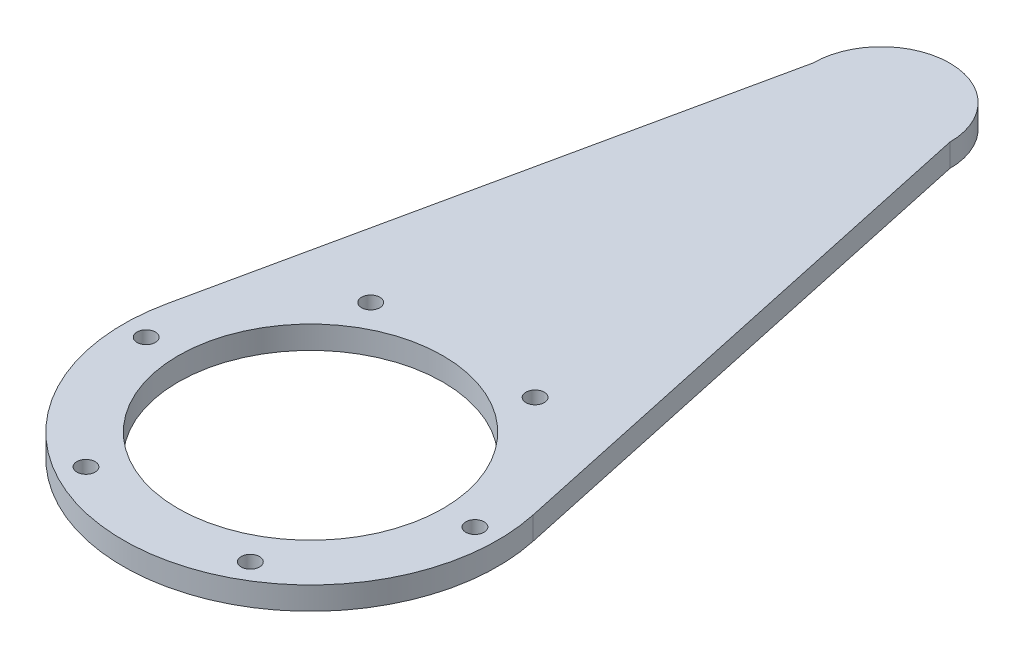
ISO-10303-21;
HEADER;
FILE_DESCRIPTION(('STEP AP214'),'2;1');
FILE_NAME('part.step','',(''),(''),'','','');
FILE_SCHEMA(('AUTOMOTIVE_DESIGN { 1 0 10303 214 1 1 1 1 }'));
ENDSEC;
DATA;
#1=APPLICATION_CONTEXT('core data for automotive mechanical design processes');
#2=APPLICATION_PROTOCOL_DEFINITION('international standard','automotive_design',2000,#1);
#3=PRODUCT_CONTEXT('',#1,'mechanical');
#4=PRODUCT('Part','Part','',(#3));
#5=PRODUCT_RELATED_PRODUCT_CATEGORY('part','',(#4));
#6=PRODUCT_DEFINITION_FORMATION('','',#4);
#7=PRODUCT_DEFINITION_CONTEXT('part definition',#1,'design');
#8=PRODUCT_DEFINITION('design','',#6,#7);
#9=PRODUCT_DEFINITION_SHAPE('','',#8);
#10=(LENGTH_UNIT() NAMED_UNIT(*) SI_UNIT(.MILLI.,.METRE.));
#11=(NAMED_UNIT(*) PLANE_ANGLE_UNIT() SI_UNIT($,.RADIAN.));
#12=(NAMED_UNIT(*) SI_UNIT($,.STERADIAN.) SOLID_ANGLE_UNIT());
#13=UNCERTAINTY_MEASURE_WITH_UNIT(LENGTH_MEASURE(1.E-05),#10,'distance_accuracy_value','');
#14=(GEOMETRIC_REPRESENTATION_CONTEXT(3) GLOBAL_UNCERTAINTY_ASSIGNED_CONTEXT((#13)) GLOBAL_UNIT_ASSIGNED_CONTEXT((#10,
#11,#12)) REPRESENTATION_CONTEXT('',''));
#15=CARTESIAN_POINT('',(0.,0.,0.));
#16=DIRECTION('',(0.,0.,1.));
#17=DIRECTION('',(1.,0.,0.));
#18=AXIS2_PLACEMENT_3D('',#15,#16,#17);
#19=CARTESIAN_POINT('',(0.,5.,-125.));
#20=DIRECTION('',(0.,1.,0.));
#21=DIRECTION('',(0.,0.,1.));
#22=AXIS2_PLACEMENT_3D('',#19,#20,#21);
#23=PLANE('',#22);
#24=CARTESIAN_POINT('',(-18.,5.,-31.1769145362398));
#25=DIRECTION('',(0.,1.,0.));
#26=DIRECTION('',(0.,0.,1.));
#27=AXIS2_PLACEMENT_3D('',#24,#25,#26);
#28=CIRCLE('',#27,2.);
#29=CARTESIAN_POINT('',(-18.,5.,-29.1769145362398));
#30=VERTEX_POINT('',#29);
#31=EDGE_CURVE('E172',#30,#30,#28,.T.);
#32=ORIENTED_EDGE('',*,*,#31,.F.);
#33=EDGE_LOOP('',(#32));
#34=FACE_BOUND('',#33,.T.);
#35=CARTESIAN_POINT('',(-18.,5.,31.1769145362398));
#36=DIRECTION('',(0.,1.,0.));
#37=DIRECTION('',(0.,0.,1.));
#38=AXIS2_PLACEMENT_3D('',#35,#36,#37);
#39=CIRCLE('',#38,2.00000000000001);
#40=CARTESIAN_POINT('',(-18.,5.,33.1769145362398));
#41=VERTEX_POINT('',#40);
#42=EDGE_CURVE('E156',#41,#41,#39,.T.);
#43=ORIENTED_EDGE('',*,*,#42,.F.);
#44=EDGE_LOOP('',(#43));
#45=FACE_BOUND('',#44,.T.);
#46=CARTESIAN_POINT('',(36.,5.,0.));
#47=DIRECTION('',(0.,1.,0.));
#48=DIRECTION('',(0.,0.,1.));
#49=AXIS2_PLACEMENT_3D('',#46,#47,#48);
#50=CIRCLE('',#49,2.);
#51=CARTESIAN_POINT('',(36.,5.,2.));
#52=VERTEX_POINT('',#51);
#53=EDGE_CURVE('E140',#52,#52,#50,.T.);
#54=ORIENTED_EDGE('',*,*,#53,.F.);
#55=EDGE_LOOP('',(#54));
#56=FACE_BOUND('',#55,.T.);
#57=CARTESIAN_POINT('',(0.,5.,-125.));
#58=DIRECTION('',(0.,1.,0.));
#59=DIRECTION('',(0.,0.,1.));
#60=AXIS2_PLACEMENT_3D('',#57,#58,#59);
#61=CIRCLE('',#60,15.);
#62=CARTESIAN_POINT('',(15.,5.,-125.));
#63=VERTEX_POINT('',#62);
#64=CARTESIAN_POINT('',(-15.,5.,-125.));
#65=VERTEX_POINT('',#64);
#66=EDGE_CURVE('E98',#63,#65,#61,.T.);
#67=ORIENTED_EDGE('',*,*,#66,.T.);
#68=DIRECTION('',(-0.210693745710355,0.,0.977552119080379));
#69=VECTOR('',#68,1.);
#70=CARTESIAN_POINT('',(-15.,5.,-125.));
#71=LINE('',#70,#69);
#72=CARTESIAN_POINT('',(-40.0796368822956,5.,-8.63844357412454));
#73=VERTEX_POINT('',#72);
#74=EDGE_CURVE('E93',#65,#73,#71,.T.);
#75=ORIENTED_EDGE('',*,*,#74,.T.);
#76=CARTESIAN_POINT('',(0.,5.,0.));
#77=DIRECTION('',(0.,1.,0.));
#78=DIRECTION('',(0.,0.,1.));
#79=AXIS2_PLACEMENT_3D('',#76,#77,#78);
#80=CIRCLE('',#79,41.);
#81=CARTESIAN_POINT('',(40.0796368822956,5.,-8.63844357412453));
#82=VERTEX_POINT('',#81);
#83=EDGE_CURVE('E96',#73,#82,#80,.T.);
#84=ORIENTED_EDGE('',*,*,#83,.T.);
#85=DIRECTION('',(-0.210693745710355,0.,-0.977552119080379));
#86=VECTOR('',#85,1.);
#87=CARTESIAN_POINT('',(15.,5.,-125.));
#88=LINE('',#87,#86);
#89=EDGE_CURVE('E63',#82,#63,#88,.T.);
#90=ORIENTED_EDGE('',*,*,#89,.T.);
#91=EDGE_LOOP('',(#67,#75,#84,#90));
#92=FACE_BOUND('',#91,.T.);
#93=CARTESIAN_POINT('',(0.,5.,0.));
#94=DIRECTION('',(0.,1.,0.));
#95=DIRECTION('',(0.,0.,1.));
#96=AXIS2_PLACEMENT_3D('',#93,#94,#95);
#97=CIRCLE('',#96,29.);
#98=CARTESIAN_POINT('',(0.,5.,29.));
#99=VERTEX_POINT('',#98);
#100=EDGE_CURVE('E118',#99,#99,#97,.T.);
#101=ORIENTED_EDGE('',*,*,#100,.F.);
#102=EDGE_LOOP('',(#101));
#103=FACE_BOUND('',#102,.T.);
#104=CARTESIAN_POINT('',(18.,5.,31.1769145362398));
#105=DIRECTION('',(0.,1.,0.));
#106=DIRECTION('',(0.,0.,1.));
#107=AXIS2_PLACEMENT_3D('',#104,#105,#106);
#108=CIRCLE('',#107,2.00000000000001);
#109=CARTESIAN_POINT('',(18.,5.,33.1769145362398));
#110=VERTEX_POINT('',#109);
#111=EDGE_CURVE('E148',#110,#110,#108,.T.);
#112=ORIENTED_EDGE('',*,*,#111,.F.);
#113=EDGE_LOOP('',(#112));
#114=FACE_BOUND('',#113,.T.);
#115=CARTESIAN_POINT('',(-36.,5.,0.));
#116=DIRECTION('',(0.,1.,0.));
#117=DIRECTION('',(0.,0.,1.));
#118=AXIS2_PLACEMENT_3D('',#115,#116,#117);
#119=CIRCLE('',#118,2.00000000000001);
#120=CARTESIAN_POINT('',(-36.,5.,2.00000000000001));
#121=VERTEX_POINT('',#120);
#122=EDGE_CURVE('E164',#121,#121,#119,.T.);
#123=ORIENTED_EDGE('',*,*,#122,.F.);
#124=EDGE_LOOP('',(#123));
#125=FACE_BOUND('',#124,.T.);
#126=CARTESIAN_POINT('',(18.,5.,-31.1769145362398));
#127=DIRECTION('',(0.,1.,0.));
#128=DIRECTION('',(0.,0.,1.));
#129=AXIS2_PLACEMENT_3D('',#126,#127,#128);
#130=CIRCLE('',#129,2.00000000000001);
#131=CARTESIAN_POINT('',(18.,5.,-29.1769145362398));
#132=VERTEX_POINT('',#131);
#133=EDGE_CURVE('E180',#132,#132,#130,.T.);
#134=ORIENTED_EDGE('',*,*,#133,.F.);
#135=EDGE_LOOP('',(#134));
#136=FACE_BOUND('',#135,.T.);
#137=ADVANCED_FACE('F45',(#34,#45,#56,#92,#103,#114,#125,#136),#23,.T.);
#138=CARTESIAN_POINT('',(0.,0.,-125.));
#139=DIRECTION('',(0.,1.,0.));
#140=DIRECTION('',(0.,0.,1.));
#141=AXIS2_PLACEMENT_3D('',#138,#139,#140);
#142=PLANE('',#141);
#143=CARTESIAN_POINT('',(0.,0.,-125.));
#144=DIRECTION('',(0.,1.,0.));
#145=DIRECTION('',(0.,0.,1.));
#146=AXIS2_PLACEMENT_3D('',#143,#144,#145);
#147=CIRCLE('',#146,15.);
#148=CARTESIAN_POINT('',(15.,0.,-125.));
#149=VERTEX_POINT('',#148);
#150=CARTESIAN_POINT('',(-15.,0.,-125.));
#151=VERTEX_POINT('',#150);
#152=EDGE_CURVE('E114',#149,#151,#147,.T.);
#153=ORIENTED_EDGE('',*,*,#152,.F.);
#154=DIRECTION('',(-0.210693745710355,0.,-0.977552119080379));
#155=VECTOR('',#154,1.);
#156=CARTESIAN_POINT('',(15.,0.,-125.));
#157=LINE('',#156,#155);
#158=CARTESIAN_POINT('',(40.0796368822956,0.,-8.63844357412453));
#159=VERTEX_POINT('',#158);
#160=EDGE_CURVE('E86',#159,#149,#157,.T.);
#161=ORIENTED_EDGE('',*,*,#160,.F.);
#162=CARTESIAN_POINT('',(0.,0.,0.));
#163=DIRECTION('',(0.,1.,0.));
#164=DIRECTION('',(0.,0.,1.));
#165=AXIS2_PLACEMENT_3D('',#162,#163,#164);
#166=CIRCLE('',#165,41.);
#167=CARTESIAN_POINT('',(-40.0796368822956,0.,-8.63844357412454));
#168=VERTEX_POINT('',#167);
#169=EDGE_CURVE('E80',#168,#159,#166,.T.);
#170=ORIENTED_EDGE('',*,*,#169,.F.);
#171=DIRECTION('',(-0.210693745710355,0.,0.977552119080379));
#172=VECTOR('',#171,1.);
#173=CARTESIAN_POINT('',(-15.,0.,-125.));
#174=LINE('',#173,#172);
#175=EDGE_CURVE('E103',#151,#168,#174,.T.);
#176=ORIENTED_EDGE('',*,*,#175,.F.);
#177=EDGE_LOOP('',(#153,#161,#170,#176));
#178=FACE_BOUND('',#177,.T.);
#179=CARTESIAN_POINT('',(0.,0.,0.));
#180=DIRECTION('',(0.,1.,0.));
#181=DIRECTION('',(0.,0.,1.));
#182=AXIS2_PLACEMENT_3D('',#179,#180,#181);
#183=CIRCLE('',#182,29.);
#184=CARTESIAN_POINT('',(0.,0.,29.));
#185=VERTEX_POINT('',#184);
#186=EDGE_CURVE('E136',#185,#185,#183,.T.);
#187=ORIENTED_EDGE('',*,*,#186,.T.);
#188=EDGE_LOOP('',(#187));
#189=FACE_BOUND('',#188,.T.);
#190=CARTESIAN_POINT('',(36.,0.,0.));
#191=DIRECTION('',(0.,1.,0.));
#192=DIRECTION('',(0.,0.,1.));
#193=AXIS2_PLACEMENT_3D('',#190,#191,#192);
#194=CIRCLE('',#193,2.);
#195=CARTESIAN_POINT('',(36.,0.,2.));
#196=VERTEX_POINT('',#195);
#197=EDGE_CURVE('E144',#196,#196,#194,.T.);
#198=ORIENTED_EDGE('',*,*,#197,.T.);
#199=EDGE_LOOP('',(#198));
#200=FACE_BOUND('',#199,.T.);
#201=CARTESIAN_POINT('',(18.,0.,31.1769145362398));
#202=DIRECTION('',(0.,1.,0.));
#203=DIRECTION('',(0.,0.,1.));
#204=AXIS2_PLACEMENT_3D('',#201,#202,#203);
#205=CIRCLE('',#204,2.00000000000001);
#206=CARTESIAN_POINT('',(18.,0.,33.1769145362398));
#207=VERTEX_POINT('',#206);
#208=EDGE_CURVE('E152',#207,#207,#205,.T.);
#209=ORIENTED_EDGE('',*,*,#208,.T.);
#210=EDGE_LOOP('',(#209));
#211=FACE_BOUND('',#210,.T.);
#212=CARTESIAN_POINT('',(-18.,0.,31.1769145362398));
#213=DIRECTION('',(0.,1.,0.));
#214=DIRECTION('',(0.,0.,1.));
#215=AXIS2_PLACEMENT_3D('',#212,#213,#214);
#216=CIRCLE('',#215,2.00000000000001);
#217=CARTESIAN_POINT('',(-18.,0.,33.1769145362398));
#218=VERTEX_POINT('',#217);
#219=EDGE_CURVE('E160',#218,#218,#216,.T.);
#220=ORIENTED_EDGE('',*,*,#219,.T.);
#221=EDGE_LOOP('',(#220));
#222=FACE_BOUND('',#221,.T.);
#223=CARTESIAN_POINT('',(-36.,0.,0.));
#224=DIRECTION('',(0.,1.,0.));
#225=DIRECTION('',(0.,0.,1.));
#226=AXIS2_PLACEMENT_3D('',#223,#224,#225);
#227=CIRCLE('',#226,2.00000000000001);
#228=CARTESIAN_POINT('',(-36.,0.,2.00000000000001));
#229=VERTEX_POINT('',#228);
#230=EDGE_CURVE('E168',#229,#229,#227,.T.);
#231=ORIENTED_EDGE('',*,*,#230,.T.);
#232=EDGE_LOOP('',(#231));
#233=FACE_BOUND('',#232,.T.);
#234=CARTESIAN_POINT('',(-18.,0.,-31.1769145362398));
#235=DIRECTION('',(0.,1.,0.));
#236=DIRECTION('',(0.,0.,1.));
#237=AXIS2_PLACEMENT_3D('',#234,#235,#236);
#238=CIRCLE('',#237,2.);
#239=CARTESIAN_POINT('',(-18.,0.,-29.1769145362398));
#240=VERTEX_POINT('',#239);
#241=EDGE_CURVE('E176',#240,#240,#238,.T.);
#242=ORIENTED_EDGE('',*,*,#241,.T.);
#243=EDGE_LOOP('',(#242));
#244=FACE_BOUND('',#243,.T.);
#245=CARTESIAN_POINT('',(18.,0.,-31.1769145362398));
#246=DIRECTION('',(0.,1.,0.));
#247=DIRECTION('',(0.,0.,1.));
#248=AXIS2_PLACEMENT_3D('',#245,#246,#247);
#249=CIRCLE('',#248,2.00000000000001);
#250=CARTESIAN_POINT('',(18.,0.,-29.1769145362398));
#251=VERTEX_POINT('',#250);
#252=EDGE_CURVE('E184',#251,#251,#249,.T.);
#253=ORIENTED_EDGE('',*,*,#252,.T.);
#254=EDGE_LOOP('',(#253));
#255=FACE_BOUND('',#254,.T.);
#256=ADVANCED_FACE('F131',(#178,#189,#200,#211,#222,#233,#244,#255),#142,.F.);
#257=CARTESIAN_POINT('',(0.,5.,-125.));
#258=DIRECTION('',(0.,-1.,0.));
#259=DIRECTION('',(0.,0.,-1.));
#260=AXIS2_PLACEMENT_3D('',#257,#258,#259);
#261=CYLINDRICAL_SURFACE('',#260,15.);
#262=ORIENTED_EDGE('',*,*,#152,.T.);
#263=DIRECTION('',(0.,-1.,0.));
#264=VECTOR('',#263,1.);
#265=CARTESIAN_POINT('',(-15.,5.,-125.));
#266=LINE('',#265,#264);
#267=EDGE_CURVE('E11',#65,#151,#266,.T.);
#268=ORIENTED_EDGE('',*,*,#267,.F.);
#269=ORIENTED_EDGE('',*,*,#66,.F.);
#270=DIRECTION('',(0.,-1.,0.));
#271=VECTOR('',#270,1.);
#272=CARTESIAN_POINT('',(15.,5.,-125.));
#273=LINE('',#272,#271);
#274=EDGE_CURVE('E110',#63,#149,#273,.T.);
#275=ORIENTED_EDGE('',*,*,#274,.T.);
#276=EDGE_LOOP('',(#262,#268,#269,#275));
#277=FACE_BOUND('',#276,.T.);
#278=ADVANCED_FACE('F47',(#277),#261,.T.);
#279=CARTESIAN_POINT('',(-15.,5.,-125.));
#280=DIRECTION('',(0.97755211908038,0.,0.210693745710355));
#281=DIRECTION('',(0.210693745710355,0.,-0.97755211908038));
#282=AXIS2_PLACEMENT_3D('',#279,#280,#281);
#283=PLANE('',#282);
#284=ORIENTED_EDGE('',*,*,#175,.T.);
#285=DIRECTION('',(0.,-1.,0.));
#286=VECTOR('',#285,1.);
#287=CARTESIAN_POINT('',(-40.0796368822956,5.,-8.63844357412454));
#288=LINE('',#287,#286);
#289=EDGE_CURVE('E55',#73,#168,#288,.T.);
#290=ORIENTED_EDGE('',*,*,#289,.F.);
#291=ORIENTED_EDGE('',*,*,#74,.F.);
#292=ORIENTED_EDGE('',*,*,#267,.T.);
#293=EDGE_LOOP('',(#284,#290,#291,#292));
#294=FACE_BOUND('',#293,.T.);
#295=ADVANCED_FACE('F102',(#294),#283,.F.);
#296=CARTESIAN_POINT('',(0.,5.,0.));
#297=DIRECTION('',(0.,-1.,0.));
#298=DIRECTION('',(0.,0.,-1.));
#299=AXIS2_PLACEMENT_3D('',#296,#297,#298);
#300=CYLINDRICAL_SURFACE('',#299,41.);
#301=ORIENTED_EDGE('',*,*,#169,.T.);
#302=DIRECTION('',(0.,-1.,0.));
#303=VECTOR('',#302,1.);
#304=CARTESIAN_POINT('',(40.0796368822956,5.,-8.63844357412453));
#305=LINE('',#304,#303);
#306=EDGE_CURVE('E105',#82,#159,#305,.T.);
#307=ORIENTED_EDGE('',*,*,#306,.F.);
#308=ORIENTED_EDGE('',*,*,#83,.F.);
#309=ORIENTED_EDGE('',*,*,#289,.T.);
#310=EDGE_LOOP('',(#301,#307,#308,#309));
#311=FACE_BOUND('',#310,.T.);
#312=ADVANCED_FACE('F106',(#311),#300,.T.);
#313=CARTESIAN_POINT('',(15.,5.,-125.));
#314=DIRECTION('',(-0.97755211908038,0.,0.210693745710355));
#315=DIRECTION('',(0.210693745710355,0.,0.97755211908038));
#316=AXIS2_PLACEMENT_3D('',#313,#314,#315);
#317=PLANE('',#316);
#318=ORIENTED_EDGE('',*,*,#160,.T.);
#319=ORIENTED_EDGE('',*,*,#274,.F.);
#320=ORIENTED_EDGE('',*,*,#89,.F.);
#321=ORIENTED_EDGE('',*,*,#306,.T.);
#322=EDGE_LOOP('',(#318,#319,#320,#321));
#323=FACE_BOUND('',#322,.T.);
#324=ADVANCED_FACE('F128',(#323),#317,.F.);
#325=CARTESIAN_POINT('',(0.,5.,0.));
#326=DIRECTION('',(0.,-1.,0.));
#327=DIRECTION('',(0.,0.,-1.));
#328=AXIS2_PLACEMENT_3D('',#325,#326,#327);
#329=CYLINDRICAL_SURFACE('',#328,29.);
#330=ORIENTED_EDGE('',*,*,#100,.T.);
#331=EDGE_LOOP('',(#330));
#332=FACE_BOUND('',#331,.T.);
#333=ORIENTED_EDGE('',*,*,#186,.F.);
#334=EDGE_LOOP('',(#333));
#335=FACE_BOUND('',#334,.T.);
#336=ADVANCED_FACE('F205',(#332,#335),#329,.F.);
#337=CARTESIAN_POINT('',(36.,5.,0.));
#338=DIRECTION('',(0.,-1.,0.));
#339=DIRECTION('',(0.,0.,-1.));
#340=AXIS2_PLACEMENT_3D('',#337,#338,#339);
#341=CYLINDRICAL_SURFACE('',#340,2.);
#342=ORIENTED_EDGE('',*,*,#53,.T.);
#343=EDGE_LOOP('',(#342));
#344=FACE_BOUND('',#343,.T.);
#345=ORIENTED_EDGE('',*,*,#197,.F.);
#346=EDGE_LOOP('',(#345));
#347=FACE_BOUND('',#346,.T.);
#348=ADVANCED_FACE('F250',(#344,#347),#341,.F.);
#349=CARTESIAN_POINT('',(18.,5.,31.1769145362398));
#350=DIRECTION('',(0.,-1.,0.));
#351=DIRECTION('',(0.,0.,-1.));
#352=AXIS2_PLACEMENT_3D('',#349,#350,#351);
#353=CYLINDRICAL_SURFACE('',#352,2.00000000000001);
#354=ORIENTED_EDGE('',*,*,#111,.T.);
#355=EDGE_LOOP('',(#354));
#356=FACE_BOUND('',#355,.T.);
#357=ORIENTED_EDGE('',*,*,#208,.F.);
#358=EDGE_LOOP('',(#357));
#359=FACE_BOUND('',#358,.T.);
#360=ADVANCED_FACE('F258',(#356,#359),#353,.F.);
#361=CARTESIAN_POINT('',(-18.,5.,31.1769145362398));
#362=DIRECTION('',(0.,-1.,0.));
#363=DIRECTION('',(0.,0.,-1.));
#364=AXIS2_PLACEMENT_3D('',#361,#362,#363);
#365=CYLINDRICAL_SURFACE('',#364,2.00000000000001);
#366=ORIENTED_EDGE('',*,*,#42,.T.);
#367=EDGE_LOOP('',(#366));
#368=FACE_BOUND('',#367,.T.);
#369=ORIENTED_EDGE('',*,*,#219,.F.);
#370=EDGE_LOOP('',(#369));
#371=FACE_BOUND('',#370,.T.);
#372=ADVANCED_FACE('F266',(#368,#371),#365,.F.);
#373=CARTESIAN_POINT('',(-36.,5.,0.));
#374=DIRECTION('',(0.,-1.,0.));
#375=DIRECTION('',(0.,0.,-1.));
#376=AXIS2_PLACEMENT_3D('',#373,#374,#375);
#377=CYLINDRICAL_SURFACE('',#376,2.00000000000001);
#378=ORIENTED_EDGE('',*,*,#122,.T.);
#379=EDGE_LOOP('',(#378));
#380=FACE_BOUND('',#379,.T.);
#381=ORIENTED_EDGE('',*,*,#230,.F.);
#382=EDGE_LOOP('',(#381));
#383=FACE_BOUND('',#382,.T.);
#384=ADVANCED_FACE('F275',(#380,#383),#377,.F.);
#385=CARTESIAN_POINT('',(-18.,5.,-31.1769145362398));
#386=DIRECTION('',(0.,-1.,0.));
#387=DIRECTION('',(0.,0.,-1.));
#388=AXIS2_PLACEMENT_3D('',#385,#386,#387);
#389=CYLINDRICAL_SURFACE('',#388,2.);
#390=ORIENTED_EDGE('',*,*,#31,.T.);
#391=EDGE_LOOP('',(#390));
#392=FACE_BOUND('',#391,.T.);
#393=ORIENTED_EDGE('',*,*,#241,.F.);
#394=EDGE_LOOP('',(#393));
#395=FACE_BOUND('',#394,.T.);
#396=ADVANCED_FACE('F284',(#392,#395),#389,.F.);
#397=CARTESIAN_POINT('',(18.,5.,-31.1769145362398));
#398=DIRECTION('',(0.,-1.,0.));
#399=DIRECTION('',(0.,0.,-1.));
#400=AXIS2_PLACEMENT_3D('',#397,#398,#399);
#401=CYLINDRICAL_SURFACE('',#400,2.00000000000001);
#402=ORIENTED_EDGE('',*,*,#133,.T.);
#403=EDGE_LOOP('',(#402));
#404=FACE_BOUND('',#403,.T.);
#405=ORIENTED_EDGE('',*,*,#252,.F.);
#406=EDGE_LOOP('',(#405));
#407=FACE_BOUND('',#406,.T.);
#408=ADVANCED_FACE('F192',(#404,#407),#401,.F.);
#409=CLOSED_SHELL('',(#137,#256,#278,#295,#312,#324,#336,#348,#360,#372,#384,#396,#408));
#410=MANIFOLD_SOLID_BREP('B2',#409);
#411=ADVANCED_BREP_SHAPE_REPRESENTATION('',(#18,#410),#14);
#412=SHAPE_DEFINITION_REPRESENTATION(#9,#411);
ENDSEC;
END-ISO-10303-21;
